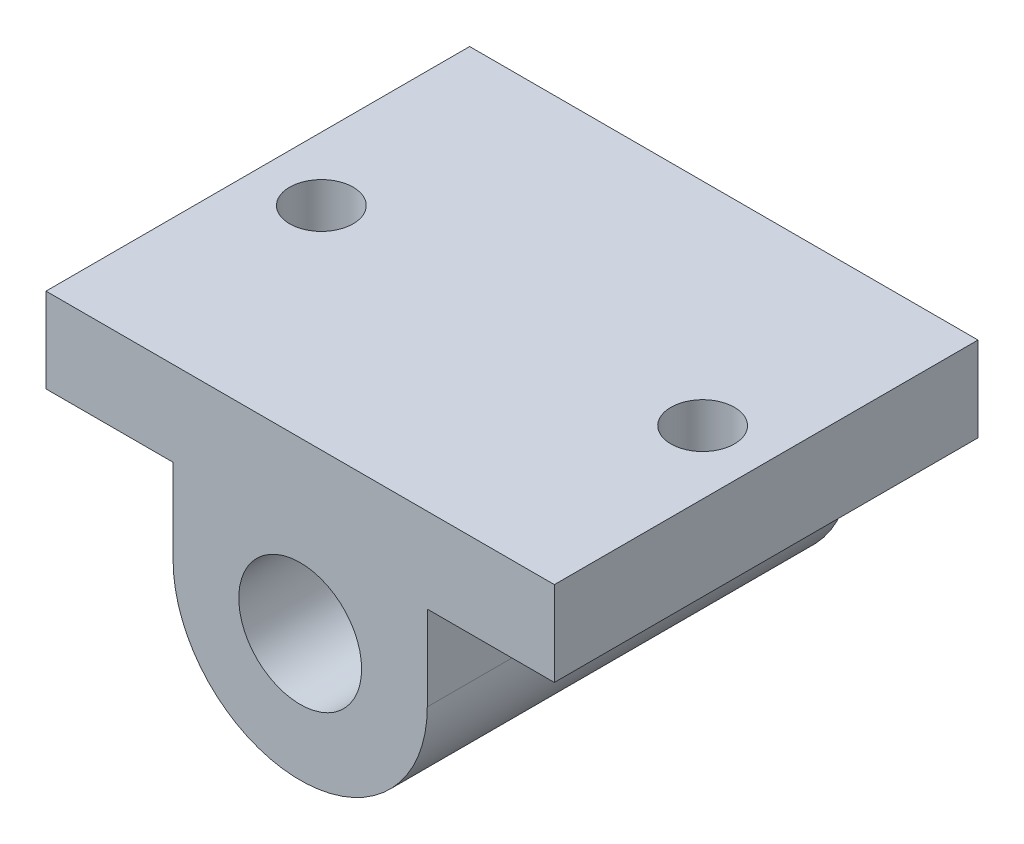
ISO-10303-21;
HEADER;
FILE_DESCRIPTION(('STEP AP214'),'2;1');
FILE_NAME('part.step','',(''),(''),'','','');
FILE_SCHEMA(('AUTOMOTIVE_DESIGN { 1 0 10303 214 1 1 1 1 }'));
ENDSEC;
DATA;
#1=APPLICATION_CONTEXT('core data for automotive mechanical design processes');
#2=APPLICATION_PROTOCOL_DEFINITION('international standard','automotive_design',2000,#1);
#3=PRODUCT_CONTEXT('',#1,'mechanical');
#4=PRODUCT('Part','Part','',(#3));
#5=PRODUCT_RELATED_PRODUCT_CATEGORY('part','',(#4));
#6=PRODUCT_DEFINITION_FORMATION('','',#4);
#7=PRODUCT_DEFINITION_CONTEXT('part definition',#1,'design');
#8=PRODUCT_DEFINITION('design','',#6,#7);
#9=PRODUCT_DEFINITION_SHAPE('','',#8);
#10=(LENGTH_UNIT() NAMED_UNIT(*) SI_UNIT(.MILLI.,.METRE.));
#11=(NAMED_UNIT(*) PLANE_ANGLE_UNIT() SI_UNIT($,.RADIAN.));
#12=(NAMED_UNIT(*) SI_UNIT($,.STERADIAN.) SOLID_ANGLE_UNIT());
#13=UNCERTAINTY_MEASURE_WITH_UNIT(LENGTH_MEASURE(1.E-05),#10,'distance_accuracy_value','');
#14=(GEOMETRIC_REPRESENTATION_CONTEXT(3) GLOBAL_UNCERTAINTY_ASSIGNED_CONTEXT((#13)) GLOBAL_UNIT_ASSIGNED_CONTEXT((#10,
#11,#12)) REPRESENTATION_CONTEXT('',''));
#15=CARTESIAN_POINT('',(0.,0.,0.));
#16=DIRECTION('',(0.,0.,1.));
#17=DIRECTION('',(1.,0.,0.));
#18=AXIS2_PLACEMENT_3D('',#15,#16,#17);
#19=CARTESIAN_POINT('',(0.,0.,-20.));
#20=DIRECTION('',(0.,0.,1.));
#21=DIRECTION('',(1.,0.,0.));
#22=AXIS2_PLACEMENT_3D('',#19,#20,#21);
#23=CYLINDRICAL_SURFACE('',#22,4.);
#24=CARTESIAN_POINT('',(0.,0.,-20.));
#25=DIRECTION('',(0.,0.,1.));
#26=DIRECTION('',(1.,0.,0.));
#27=AXIS2_PLACEMENT_3D('',#24,#25,#26);
#28=CIRCLE('',#27,4.);
#29=CARTESIAN_POINT('',(4.,0.,-20.));
#30=VERTEX_POINT('',#29);
#31=EDGE_CURVE('E153',#30,#30,#28,.T.);
#32=ORIENTED_EDGE('',*,*,#31,.F.);
#33=EDGE_LOOP('',(#32));
#34=FACE_BOUND('',#33,.T.);
#35=CARTESIAN_POINT('',(0.,0.,-17.5));
#36=DIRECTION('',(0.,0.,1.));
#37=DIRECTION('',(1.,0.,0.));
#38=AXIS2_PLACEMENT_3D('',#35,#36,#37);
#39=CIRCLE('',#38,4.);
#40=CARTESIAN_POINT('',(4.,0.,-17.5));
#41=VERTEX_POINT('',#40);
#42=EDGE_CURVE('E11',#41,#41,#39,.F.);
#43=ORIENTED_EDGE('',*,*,#42,.F.);
#44=EDGE_LOOP('',(#43));
#45=FACE_BOUND('',#44,.T.);
#46=ADVANCED_FACE('F45',(#34,#45),#23,.F.);
#47=CARTESIAN_POINT('',(0.,0.,-20.));
#48=DIRECTION('',(0.,0.,1.));
#49=DIRECTION('',(1.,0.,0.));
#50=AXIS2_PLACEMENT_3D('',#47,#48,#49);
#51=CYLINDRICAL_SURFACE('',#50,6.);
#52=CARTESIAN_POINT('',(0.,0.,0.));
#53=DIRECTION('',(0.,0.,1.));
#54=DIRECTION('',(1.,0.,0.));
#55=AXIS2_PLACEMENT_3D('',#52,#53,#54);
#56=CIRCLE('',#55,6.);
#57=CARTESIAN_POINT('',(-6.,0.,0.));
#58=VERTEX_POINT('',#57);
#59=CARTESIAN_POINT('',(6.,0.,0.));
#60=VERTEX_POINT('',#59);
#61=EDGE_CURVE('E157',#58,#60,#56,.T.);
#62=ORIENTED_EDGE('',*,*,#61,.F.);
#63=DIRECTION('',(0.,0.,1.));
#64=VECTOR('',#63,1.);
#65=CARTESIAN_POINT('',(-6.,0.,-20.));
#66=LINE('',#65,#64);
#67=CARTESIAN_POINT('',(-6.,0.,-20.));
#68=VERTEX_POINT('',#67);
#69=EDGE_CURVE('E56',#68,#58,#66,.T.);
#70=ORIENTED_EDGE('',*,*,#69,.F.);
#71=CARTESIAN_POINT('',(0.,0.,-20.));
#72=DIRECTION('',(0.,0.,1.));
#73=DIRECTION('',(1.,0.,0.));
#74=AXIS2_PLACEMENT_3D('',#71,#72,#73);
#75=CIRCLE('',#74,6.);
#76=CARTESIAN_POINT('',(6.,0.,-20.));
#77=VERTEX_POINT('',#76);
#78=EDGE_CURVE('E186',#68,#77,#75,.T.);
#79=ORIENTED_EDGE('',*,*,#78,.T.);
#80=DIRECTION('',(0.,0.,1.));
#81=VECTOR('',#80,1.);
#82=CARTESIAN_POINT('',(6.,0.,-20.));
#83=LINE('',#82,#81);
#84=EDGE_CURVE('E104',#77,#60,#83,.T.);
#85=ORIENTED_EDGE('',*,*,#84,.T.);
#86=EDGE_LOOP('',(#62,#70,#79,#85));
#87=FACE_BOUND('',#86,.T.);
#88=ADVANCED_FACE('F47',(#87),#51,.T.);
#89=CARTESIAN_POINT('',(-6.,0.,-20.));
#90=DIRECTION('',(1.,0.,0.));
#91=DIRECTION('',(0.,1.,0.));
#92=AXIS2_PLACEMENT_3D('',#89,#90,#91);
#93=PLANE('',#92);
#94=DIRECTION('',(0.,1.,0.));
#95=VECTOR('',#94,1.);
#96=CARTESIAN_POINT('',(-6.,0.,0.));
#97=LINE('',#96,#95);
#98=CARTESIAN_POINT('',(-6.,4.,0.));
#99=VERTEX_POINT('',#98);
#100=EDGE_CURVE('E183',#58,#99,#97,.T.);
#101=ORIENTED_EDGE('',*,*,#100,.T.);
#102=DIRECTION('',(0.,0.,1.));
#103=VECTOR('',#102,1.);
#104=CARTESIAN_POINT('',(-6.,4.,-20.));
#105=LINE('',#104,#103);
#106=CARTESIAN_POINT('',(-6.,4.,-20.));
#107=VERTEX_POINT('',#106);
#108=EDGE_CURVE('E93',#107,#99,#105,.T.);
#109=ORIENTED_EDGE('',*,*,#108,.F.);
#110=DIRECTION('',(0.,1.,0.));
#111=VECTOR('',#110,1.);
#112=CARTESIAN_POINT('',(-6.,0.,-20.));
#113=LINE('',#112,#111);
#114=EDGE_CURVE('E139',#68,#107,#113,.T.);
#115=ORIENTED_EDGE('',*,*,#114,.F.);
#116=ORIENTED_EDGE('',*,*,#69,.T.);
#117=EDGE_LOOP('',(#101,#109,#115,#116));
#118=FACE_BOUND('',#117,.T.);
#119=ADVANCED_FACE('F208',(#118),#93,.F.);
#120=CARTESIAN_POINT('',(0.,4.,-20.));
#121=DIRECTION('',(0.,-1.,0.));
#122=DIRECTION('',(0.,0.,-1.));
#123=AXIS2_PLACEMENT_3D('',#120,#121,#122);
#124=PLANE('',#123);
#125=CARTESIAN_POINT('',(-9.,4.,-10.));
#126=DIRECTION('',(0.,-1.,0.));
#127=DIRECTION('',(0.,0.,-1.));
#128=AXIS2_PLACEMENT_3D('',#125,#126,#127);
#129=CIRCLE('',#128,1.5);
#130=CARTESIAN_POINT('',(-9.,4.,-11.5));
#131=VERTEX_POINT('',#130);
#132=EDGE_CURVE('E263',#131,#131,#129,.T.);
#133=ORIENTED_EDGE('',*,*,#132,.F.);
#134=EDGE_LOOP('',(#133));
#135=FACE_BOUND('',#134,.T.);
#136=DIRECTION('',(1.,0.,0.));
#137=VECTOR('',#136,1.);
#138=CARTESIAN_POINT('',(0.,4.,0.));
#139=LINE('',#138,#137);
#140=CARTESIAN_POINT('',(-12.,4.,0.));
#141=VERTEX_POINT('',#140);
#142=EDGE_CURVE('E123',#141,#99,#139,.T.);
#143=ORIENTED_EDGE('',*,*,#142,.F.);
#144=DIRECTION('',(0.,0.,1.));
#145=VECTOR('',#144,1.);
#146=CARTESIAN_POINT('',(-12.,4.,-20.));
#147=LINE('',#146,#145);
#148=CARTESIAN_POINT('',(-12.,4.,-20.));
#149=VERTEX_POINT('',#148);
#150=EDGE_CURVE('E118',#149,#141,#147,.T.);
#151=ORIENTED_EDGE('',*,*,#150,.F.);
#152=DIRECTION('',(1.,0.,0.));
#153=VECTOR('',#152,1.);
#154=CARTESIAN_POINT('',(0.,4.,-20.));
#155=LINE('',#154,#153);
#156=EDGE_CURVE('E121',#149,#107,#155,.T.);
#157=ORIENTED_EDGE('',*,*,#156,.T.);
#158=ORIENTED_EDGE('',*,*,#108,.T.);
#159=EDGE_LOOP('',(#143,#151,#157,#158));
#160=FACE_BOUND('',#159,.T.);
#161=ADVANCED_FACE('F120',(#135,#160),#124,.T.);
#162=CARTESIAN_POINT('',(-12.,0.,-20.));
#163=DIRECTION('',(-1.,0.,0.));
#164=DIRECTION('',(0.,0.,1.));
#165=AXIS2_PLACEMENT_3D('',#162,#163,#164);
#166=PLANE('',#165);
#167=DIRECTION('',(0.,-1.,0.));
#168=VECTOR('',#167,1.);
#169=CARTESIAN_POINT('',(-12.,0.,0.));
#170=LINE('',#169,#168);
#171=CARTESIAN_POINT('',(-12.,8.,0.));
#172=VERTEX_POINT('',#171);
#173=EDGE_CURVE('E178',#172,#141,#170,.T.);
#174=ORIENTED_EDGE('',*,*,#173,.F.);
#175=DIRECTION('',(0.,0.,1.));
#176=VECTOR('',#175,1.);
#177=CARTESIAN_POINT('',(-12.,8.,-20.));
#178=LINE('',#177,#176);
#179=CARTESIAN_POINT('',(-12.,8.,-20.));
#180=VERTEX_POINT('',#179);
#181=EDGE_CURVE('E129',#180,#172,#178,.T.);
#182=ORIENTED_EDGE('',*,*,#181,.F.);
#183=DIRECTION('',(0.,-1.,0.));
#184=VECTOR('',#183,1.);
#185=CARTESIAN_POINT('',(-12.,0.,-20.));
#186=LINE('',#185,#184);
#187=EDGE_CURVE('E137',#180,#149,#186,.T.);
#188=ORIENTED_EDGE('',*,*,#187,.T.);
#189=ORIENTED_EDGE('',*,*,#150,.T.);
#190=EDGE_LOOP('',(#174,#182,#188,#189));
#191=FACE_BOUND('',#190,.T.);
#192=ADVANCED_FACE('F142',(#191),#166,.T.);
#193=CARTESIAN_POINT('',(0.,8.,-20.));
#194=DIRECTION('',(0.,1.,0.));
#195=DIRECTION('',(-1.,0.,0.));
#196=AXIS2_PLACEMENT_3D('',#193,#194,#195);
#197=PLANE('',#196);
#198=CARTESIAN_POINT('',(9.,8.,-10.));
#199=DIRECTION('',(0.,1.,0.));
#200=DIRECTION('',(-1.,0.,0.));
#201=AXIS2_PLACEMENT_3D('',#198,#199,#200);
#202=CIRCLE('',#201,1.5);
#203=CARTESIAN_POINT('',(7.5,8.,-10.));
#204=VERTEX_POINT('',#203);
#205=EDGE_CURVE('E270',#204,#204,#202,.T.);
#206=ORIENTED_EDGE('',*,*,#205,.F.);
#207=EDGE_LOOP('',(#206));
#208=FACE_BOUND('',#207,.T.);
#209=CARTESIAN_POINT('',(-9.,8.,-10.));
#210=DIRECTION('',(0.,1.,0.));
#211=DIRECTION('',(-1.,0.,0.));
#212=AXIS2_PLACEMENT_3D('',#209,#210,#211);
#213=CIRCLE('',#212,1.5);
#214=CARTESIAN_POINT('',(-10.5,8.,-10.));
#215=VERTEX_POINT('',#214);
#216=EDGE_CURVE('E49',#215,#215,#213,.T.);
#217=ORIENTED_EDGE('',*,*,#216,.F.);
#218=EDGE_LOOP('',(#217));
#219=FACE_BOUND('',#218,.T.);
#220=DIRECTION('',(-1.,0.,0.));
#221=VECTOR('',#220,1.);
#222=CARTESIAN_POINT('',(0.,8.,0.));
#223=LINE('',#222,#221);
#224=CARTESIAN_POINT('',(12.,8.,0.));
#225=VERTEX_POINT('',#224);
#226=EDGE_CURVE('E174',#225,#172,#223,.T.);
#227=ORIENTED_EDGE('',*,*,#226,.F.);
#228=DIRECTION('',(0.,0.,1.));
#229=VECTOR('',#228,1.);
#230=CARTESIAN_POINT('',(12.,8.,-20.));
#231=LINE('',#230,#229);
#232=CARTESIAN_POINT('',(12.,8.,-20.));
#233=VERTEX_POINT('',#232);
#234=EDGE_CURVE('E193',#233,#225,#231,.T.);
#235=ORIENTED_EDGE('',*,*,#234,.F.);
#236=DIRECTION('',(-1.,0.,0.));
#237=VECTOR('',#236,1.);
#238=CARTESIAN_POINT('',(0.,8.,-20.));
#239=LINE('',#238,#237);
#240=EDGE_CURVE('E144',#233,#180,#239,.T.);
#241=ORIENTED_EDGE('',*,*,#240,.T.);
#242=ORIENTED_EDGE('',*,*,#181,.T.);
#243=EDGE_LOOP('',(#227,#235,#241,#242));
#244=FACE_BOUND('',#243,.T.);
#245=ADVANCED_FACE('F232',(#208,#219,#244),#197,.T.);
#246=CARTESIAN_POINT('',(12.,0.,-20.));
#247=DIRECTION('',(1.,0.,0.));
#248=DIRECTION('',(0.,0.,-1.));
#249=AXIS2_PLACEMENT_3D('',#246,#247,#248);
#250=PLANE('',#249);
#251=DIRECTION('',(0.,1.,0.));
#252=VECTOR('',#251,1.);
#253=CARTESIAN_POINT('',(12.,0.,0.));
#254=LINE('',#253,#252);
#255=CARTESIAN_POINT('',(12.,4.,0.));
#256=VERTEX_POINT('',#255);
#257=EDGE_CURVE('E170',#256,#225,#254,.T.);
#258=ORIENTED_EDGE('',*,*,#257,.F.);
#259=DIRECTION('',(0.,0.,1.));
#260=VECTOR('',#259,1.);
#261=CARTESIAN_POINT('',(12.,4.,-20.));
#262=LINE('',#261,#260);
#263=CARTESIAN_POINT('',(12.,4.,-20.));
#264=VERTEX_POINT('',#263);
#265=EDGE_CURVE('E196',#264,#256,#262,.T.);
#266=ORIENTED_EDGE('',*,*,#265,.F.);
#267=DIRECTION('',(0.,1.,0.));
#268=VECTOR('',#267,1.);
#269=CARTESIAN_POINT('',(12.,0.,-20.));
#270=LINE('',#269,#268);
#271=EDGE_CURVE('E147',#264,#233,#270,.T.);
#272=ORIENTED_EDGE('',*,*,#271,.T.);
#273=ORIENTED_EDGE('',*,*,#234,.T.);
#274=EDGE_LOOP('',(#258,#266,#272,#273));
#275=FACE_BOUND('',#274,.T.);
#276=ADVANCED_FACE('F227',(#275),#250,.T.);
#277=CARTESIAN_POINT('',(0.,4.,-20.));
#278=DIRECTION('',(0.,-1.,0.));
#279=DIRECTION('',(0.,0.,-1.));
#280=AXIS2_PLACEMENT_3D('',#277,#278,#279);
#281=PLANE('',#280);
#282=CARTESIAN_POINT('',(9.,4.,-10.));
#283=DIRECTION('',(0.,-1.,0.));
#284=DIRECTION('',(0.,0.,-1.));
#285=AXIS2_PLACEMENT_3D('',#282,#283,#284);
#286=CIRCLE('',#285,1.5);
#287=CARTESIAN_POINT('',(9.,4.,-11.5));
#288=VERTEX_POINT('',#287);
#289=EDGE_CURVE('E266',#288,#288,#286,.T.);
#290=ORIENTED_EDGE('',*,*,#289,.F.);
#291=EDGE_LOOP('',(#290));
#292=FACE_BOUND('',#291,.T.);
#293=DIRECTION('',(1.,0.,0.));
#294=VECTOR('',#293,1.);
#295=CARTESIAN_POINT('',(0.,4.,0.));
#296=LINE('',#295,#294);
#297=CARTESIAN_POINT('',(6.,4.,0.));
#298=VERTEX_POINT('',#297);
#299=EDGE_CURVE('E166',#298,#256,#296,.T.);
#300=ORIENTED_EDGE('',*,*,#299,.F.);
#301=DIRECTION('',(0.,0.,1.));
#302=VECTOR('',#301,1.);
#303=CARTESIAN_POINT('',(6.,4.,-20.));
#304=LINE('',#303,#302);
#305=CARTESIAN_POINT('',(6.,4.,-20.));
#306=VERTEX_POINT('',#305);
#307=EDGE_CURVE('E199',#306,#298,#304,.T.);
#308=ORIENTED_EDGE('',*,*,#307,.F.);
#309=DIRECTION('',(1.,0.,0.));
#310=VECTOR('',#309,1.);
#311=CARTESIAN_POINT('',(0.,4.,-20.));
#312=LINE('',#311,#310);
#313=EDGE_CURVE('E214',#306,#264,#312,.T.);
#314=ORIENTED_EDGE('',*,*,#313,.T.);
#315=ORIENTED_EDGE('',*,*,#265,.T.);
#316=EDGE_LOOP('',(#300,#308,#314,#315));
#317=FACE_BOUND('',#316,.T.);
#318=ADVANCED_FACE('F230',(#292,#317),#281,.T.);
#319=CARTESIAN_POINT('',(6.,0.,-20.));
#320=DIRECTION('',(1.,0.,0.));
#321=DIRECTION('',(0.,1.,0.));
#322=AXIS2_PLACEMENT_3D('',#319,#320,#321);
#323=PLANE('',#322);
#324=DIRECTION('',(0.,1.,0.));
#325=VECTOR('',#324,1.);
#326=CARTESIAN_POINT('',(6.,0.,0.));
#327=LINE('',#326,#325);
#328=EDGE_CURVE('E161',#60,#298,#327,.T.);
#329=ORIENTED_EDGE('',*,*,#328,.F.);
#330=ORIENTED_EDGE('',*,*,#84,.F.);
#331=DIRECTION('',(0.,1.,0.));
#332=VECTOR('',#331,1.);
#333=CARTESIAN_POINT('',(6.,0.,-20.));
#334=LINE('',#333,#332);
#335=EDGE_CURVE('E210',#77,#306,#334,.T.);
#336=ORIENTED_EDGE('',*,*,#335,.T.);
#337=ORIENTED_EDGE('',*,*,#307,.T.);
#338=EDGE_LOOP('',(#329,#330,#336,#337));
#339=FACE_BOUND('',#338,.T.);
#340=ADVANCED_FACE('F203',(#339),#323,.T.);
#341=CARTESIAN_POINT('',(0.,0.,-20.));
#342=DIRECTION('',(0.,0.,1.));
#343=DIRECTION('',(1.,0.,0.));
#344=AXIS2_PLACEMENT_3D('',#341,#342,#343);
#345=PLANE('',#344);
#346=ORIENTED_EDGE('',*,*,#78,.F.);
#347=ORIENTED_EDGE('',*,*,#114,.T.);
#348=ORIENTED_EDGE('',*,*,#156,.F.);
#349=ORIENTED_EDGE('',*,*,#187,.F.);
#350=ORIENTED_EDGE('',*,*,#240,.F.);
#351=ORIENTED_EDGE('',*,*,#271,.F.);
#352=ORIENTED_EDGE('',*,*,#313,.F.);
#353=ORIENTED_EDGE('',*,*,#335,.F.);
#354=EDGE_LOOP('',(#346,#347,#348,#349,#350,#351,#352,#353));
#355=FACE_BOUND('',#354,.T.);
#356=ORIENTED_EDGE('',*,*,#31,.T.);
#357=EDGE_LOOP('',(#356));
#358=FACE_BOUND('',#357,.T.);
#359=ADVANCED_FACE('F134',(#355,#358),#345,.F.);
#360=CARTESIAN_POINT('',(0.,0.,0.));
#361=DIRECTION('',(0.,0.,1.));
#362=DIRECTION('',(1.,0.,0.));
#363=AXIS2_PLACEMENT_3D('',#360,#361,#362);
#364=PLANE('',#363);
#365=ORIENTED_EDGE('',*,*,#61,.T.);
#366=ORIENTED_EDGE('',*,*,#328,.T.);
#367=ORIENTED_EDGE('',*,*,#299,.T.);
#368=ORIENTED_EDGE('',*,*,#257,.T.);
#369=ORIENTED_EDGE('',*,*,#226,.T.);
#370=ORIENTED_EDGE('',*,*,#173,.T.);
#371=ORIENTED_EDGE('',*,*,#142,.T.);
#372=ORIENTED_EDGE('',*,*,#100,.F.);
#373=EDGE_LOOP('',(#365,#366,#367,#368,#369,#370,#371,#372));
#374=FACE_BOUND('',#373,.T.);
#375=CARTESIAN_POINT('',(0.,0.,0.));
#376=DIRECTION('',(0.,0.,1.));
#377=DIRECTION('',(1.,0.,0.));
#378=AXIS2_PLACEMENT_3D('',#375,#376,#377);
#379=CIRCLE('',#378,2.9);
#380=CARTESIAN_POINT('',(2.9,0.,0.));
#381=VERTEX_POINT('',#380);
#382=EDGE_CURVE('E217',#381,#381,#379,.T.);
#383=ORIENTED_EDGE('',*,*,#382,.F.);
#384=EDGE_LOOP('',(#383));
#385=FACE_BOUND('',#384,.T.);
#386=ADVANCED_FACE('F206',(#374,#385),#364,.T.);
#387=CARTESIAN_POINT('',(0.,0.,-17.5));
#388=DIRECTION('',(0.,0.,1.));
#389=DIRECTION('',(1.,0.,0.));
#390=AXIS2_PLACEMENT_3D('',#387,#388,#389);
#391=PLANE('',#390);
#392=CARTESIAN_POINT('',(0.,0.,-17.5));
#393=DIRECTION('',(0.,0.,1.));
#394=DIRECTION('',(1.,0.,0.));
#395=AXIS2_PLACEMENT_3D('',#392,#393,#394);
#396=CIRCLE('',#395,2.9);
#397=CARTESIAN_POINT('',(2.9,0.,-17.5));
#398=VERTEX_POINT('',#397);
#399=EDGE_CURVE('E162',#398,#398,#396,.T.);
#400=ORIENTED_EDGE('',*,*,#399,.T.);
#401=EDGE_LOOP('',(#400));
#402=FACE_BOUND('',#401,.T.);
#403=ORIENTED_EDGE('',*,*,#42,.T.);
#404=EDGE_LOOP('',(#403));
#405=FACE_BOUND('',#404,.T.);
#406=ADVANCED_FACE('F300',(#402,#405),#391,.F.);
#407=CARTESIAN_POINT('',(0.,0.,-17.5));
#408=DIRECTION('',(0.,0.,1.));
#409=DIRECTION('',(1.,0.,0.));
#410=AXIS2_PLACEMENT_3D('',#407,#408,#409);
#411=CYLINDRICAL_SURFACE('',#410,2.9);
#412=ORIENTED_EDGE('',*,*,#399,.F.);
#413=EDGE_LOOP('',(#412));
#414=FACE_BOUND('',#413,.T.);
#415=ORIENTED_EDGE('',*,*,#382,.T.);
#416=EDGE_LOOP('',(#415));
#417=FACE_BOUND('',#416,.T.);
#418=ADVANCED_FACE('F294',(#414,#417),#411,.F.);
#419=CARTESIAN_POINT('',(9.,21.5,-10.));
#420=DIRECTION('',(0.,-1.,0.));
#421=DIRECTION('',(0.,0.,-1.));
#422=AXIS2_PLACEMENT_3D('',#419,#420,#421);
#423=CYLINDRICAL_SURFACE('',#422,1.5);
#424=ORIENTED_EDGE('',*,*,#205,.T.);
#425=EDGE_LOOP('',(#424));
#426=FACE_BOUND('',#425,.T.);
#427=ORIENTED_EDGE('',*,*,#289,.T.);
#428=EDGE_LOOP('',(#427));
#429=FACE_BOUND('',#428,.T.);
#430=ADVANCED_FACE('F289',(#426,#429),#423,.F.);
#431=CARTESIAN_POINT('',(-9.,21.5,-10.));
#432=DIRECTION('',(0.,-1.,0.));
#433=DIRECTION('',(0.,0.,-1.));
#434=AXIS2_PLACEMENT_3D('',#431,#432,#433);
#435=CYLINDRICAL_SURFACE('',#434,1.5);
#436=ORIENTED_EDGE('',*,*,#216,.T.);
#437=EDGE_LOOP('',(#436));
#438=FACE_BOUND('',#437,.T.);
#439=ORIENTED_EDGE('',*,*,#132,.T.);
#440=EDGE_LOOP('',(#439));
#441=FACE_BOUND('',#440,.T.);
#442=ADVANCED_FACE('F287',(#438,#441),#435,.F.);
#443=CLOSED_SHELL('',(#46,#88,#119,#161,#192,#245,#276,#318,#340,#359,#386,#406,#418,#430,#442));
#444=MANIFOLD_SOLID_BREP('B2',#443);
#445=ADVANCED_BREP_SHAPE_REPRESENTATION('',(#18,#444),#14);
#446=SHAPE_DEFINITION_REPRESENTATION(#9,#445);
ENDSEC;
END-ISO-10303-21;
